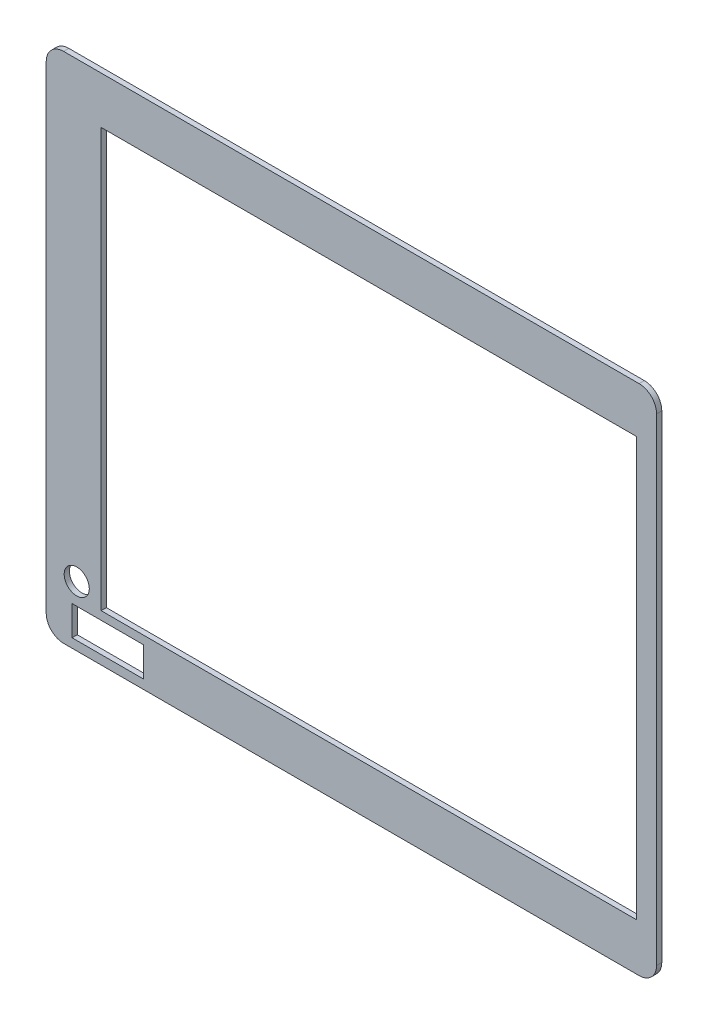
ISO-10303-21;
HEADER;
FILE_DESCRIPTION(('STEP AP214'),'2;1');
FILE_NAME('part.step','',(''),(''),'','','');
FILE_SCHEMA(('AUTOMOTIVE_DESIGN { 1 0 10303 214 1 1 1 1 }'));
ENDSEC;
DATA;
#1=APPLICATION_CONTEXT('core data for automotive mechanical design processes');
#2=APPLICATION_PROTOCOL_DEFINITION('international standard','automotive_design',2000,#1);
#3=PRODUCT_CONTEXT('',#1,'mechanical');
#4=PRODUCT('Part','Part','',(#3));
#5=PRODUCT_RELATED_PRODUCT_CATEGORY('part','',(#4));
#6=PRODUCT_DEFINITION_FORMATION('','',#4);
#7=PRODUCT_DEFINITION_CONTEXT('part definition',#1,'design');
#8=PRODUCT_DEFINITION('design','',#6,#7);
#9=PRODUCT_DEFINITION_SHAPE('','',#8);
#10=(LENGTH_UNIT() NAMED_UNIT(*) SI_UNIT(.MILLI.,.METRE.));
#11=(NAMED_UNIT(*) PLANE_ANGLE_UNIT() SI_UNIT($,.RADIAN.));
#12=(NAMED_UNIT(*) SI_UNIT($,.STERADIAN.) SOLID_ANGLE_UNIT());
#13=UNCERTAINTY_MEASURE_WITH_UNIT(LENGTH_MEASURE(1.E-05),#10,'distance_accuracy_value','');
#14=(GEOMETRIC_REPRESENTATION_CONTEXT(3) GLOBAL_UNCERTAINTY_ASSIGNED_CONTEXT((#13)) GLOBAL_UNIT_ASSIGNED_CONTEXT((#10,
#11,#12)) REPRESENTATION_CONTEXT('',''));
#15=CARTESIAN_POINT('',(0.,0.,0.));
#16=DIRECTION('',(0.,0.,1.));
#17=DIRECTION('',(1.,0.,0.));
#18=AXIS2_PLACEMENT_3D('',#15,#16,#17);
#19=CARTESIAN_POINT('',(0.,0.,6.));
#20=DIRECTION('',(0.,0.,-1.));
#21=DIRECTION('',(-1.,0.,0.));
#22=AXIS2_PLACEMENT_3D('',#19,#20,#21);
#23=PLANE('',#22);
#24=CARTESIAN_POINT('',(-315.,-225.,6.));
#25=DIRECTION('',(0.,0.,1.));
#26=DIRECTION('',(1.,0.,0.));
#27=AXIS2_PLACEMENT_3D('',#24,#25,#26);
#28=CIRCLE('',#27,14.4);
#29=CARTESIAN_POINT('',(-300.6,-225.,6.00000000000001));
#30=VERTEX_POINT('',#29);
#31=EDGE_CURVE('E193',#30,#30,#28,.T.);
#32=ORIENTED_EDGE('',*,*,#31,.F.);
#33=EDGE_LOOP('',(#32));
#34=FACE_BOUND('',#33,.T.);
#35=DIRECTION('',(-1.,0.,0.));
#36=VECTOR('',#35,1.);
#37=CARTESIAN_POINT('',(-350.,294.,6.));
#38=LINE('',#37,#36);
#39=CARTESIAN_POINT('',(330.,294.,6.));
#40=VERTEX_POINT('',#39);
#41=CARTESIAN_POINT('',(-330.,294.,6.));
#42=VERTEX_POINT('',#41);
#43=EDGE_CURVE('E228',#40,#42,#38,.T.);
#44=ORIENTED_EDGE('',*,*,#43,.T.);
#45=CARTESIAN_POINT('',(-330.,274.,6.));
#46=DIRECTION('',(0.,0.,-1.));
#47=DIRECTION('',(-1.,0.,0.));
#48=AXIS2_PLACEMENT_3D('',#45,#46,#47);
#49=CIRCLE('',#48,20.);
#50=CARTESIAN_POINT('',(-350.,274.,6.));
#51=VERTEX_POINT('',#50);
#52=EDGE_CURVE('E291',#42,#51,#49,.F.);
#53=ORIENTED_EDGE('',*,*,#52,.T.);
#54=DIRECTION('',(0.,-1.,0.));
#55=VECTOR('',#54,1.);
#56=CARTESIAN_POINT('',(-350.,-294.,6.));
#57=LINE('',#56,#55);
#58=CARTESIAN_POINT('',(-350.,-274.,6.));
#59=VERTEX_POINT('',#58);
#60=EDGE_CURVE('E233',#51,#59,#57,.T.);
#61=ORIENTED_EDGE('',*,*,#60,.T.);
#62=CARTESIAN_POINT('',(-330.,-274.,6.));
#63=DIRECTION('',(0.,0.,-1.));
#64=DIRECTION('',(-1.,0.,0.));
#65=AXIS2_PLACEMENT_3D('',#62,#63,#64);
#66=CIRCLE('',#65,20.);
#67=CARTESIAN_POINT('',(-330.,-294.,6.));
#68=VERTEX_POINT('',#67);
#69=EDGE_CURVE('E282',#59,#68,#66,.F.);
#70=ORIENTED_EDGE('',*,*,#69,.T.);
#71=DIRECTION('',(1.,0.,0.));
#72=VECTOR('',#71,1.);
#73=CARTESIAN_POINT('',(-350.,-294.,6.));
#74=LINE('',#73,#72);
#75=CARTESIAN_POINT('',(330.,-294.,6.));
#76=VERTEX_POINT('',#75);
#77=EDGE_CURVE('E237',#68,#76,#74,.T.);
#78=ORIENTED_EDGE('',*,*,#77,.T.);
#79=CARTESIAN_POINT('',(330.,-274.,6.));
#80=DIRECTION('',(0.,0.,-1.));
#81=DIRECTION('',(-1.,0.,0.));
#82=AXIS2_PLACEMENT_3D('',#79,#80,#81);
#83=CIRCLE('',#82,20.);
#84=CARTESIAN_POINT('',(350.,-274.,6.));
#85=VERTEX_POINT('',#84);
#86=EDGE_CURVE('E285',#76,#85,#83,.F.);
#87=ORIENTED_EDGE('',*,*,#86,.T.);
#88=DIRECTION('',(0.,1.,0.));
#89=VECTOR('',#88,1.);
#90=CARTESIAN_POINT('',(350.,-294.,6.));
#91=LINE('',#90,#89);
#92=CARTESIAN_POINT('',(350.,274.,6.));
#93=VERTEX_POINT('',#92);
#94=EDGE_CURVE('E224',#85,#93,#91,.T.);
#95=ORIENTED_EDGE('',*,*,#94,.T.);
#96=CARTESIAN_POINT('',(330.,274.,6.));
#97=DIRECTION('',(0.,0.,-1.));
#98=DIRECTION('',(-1.,0.,0.));
#99=AXIS2_PLACEMENT_3D('',#96,#97,#98);
#100=CIRCLE('',#99,20.);
#101=EDGE_CURVE('E288',#93,#40,#100,.F.);
#102=ORIENTED_EDGE('',*,*,#101,.T.);
#103=EDGE_LOOP('',(#44,#53,#61,#70,#78,#87,#95,#102));
#104=FACE_BOUND('',#103,.T.);
#105=DIRECTION('',(0.,1.,0.));
#106=VECTOR('',#105,1.);
#107=CARTESIAN_POINT('',(327.,-240.,6.));
#108=LINE('',#107,#106);
#109=CARTESIAN_POINT('',(327.,-240.,6.));
#110=VERTEX_POINT('',#109);
#111=CARTESIAN_POINT('',(327.,240.,6.));
#112=VERTEX_POINT('',#111);
#113=EDGE_CURVE('E200',#110,#112,#108,.T.);
#114=ORIENTED_EDGE('',*,*,#113,.F.);
#115=DIRECTION('',(1.,0.,0.));
#116=VECTOR('',#115,1.);
#117=CARTESIAN_POINT('',(-287.,-240.,6.));
#118=LINE('',#117,#116);
#119=CARTESIAN_POINT('',(-287.,-240.,6.));
#120=VERTEX_POINT('',#119);
#121=EDGE_CURVE('E70',#120,#110,#118,.T.);
#122=ORIENTED_EDGE('',*,*,#121,.F.);
#123=DIRECTION('',(0.,1.,0.));
#124=VECTOR('',#123,1.);
#125=CARTESIAN_POINT('',(-287.,-240.,6.));
#126=LINE('',#125,#124);
#127=CARTESIAN_POINT('',(-287.,240.,6.));
#128=VERTEX_POINT('',#127);
#129=EDGE_CURVE('E208',#120,#128,#126,.T.);
#130=ORIENTED_EDGE('',*,*,#129,.T.);
#131=DIRECTION('',(1.,0.,0.));
#132=VECTOR('',#131,1.);
#133=CARTESIAN_POINT('',(-287.,240.,6.));
#134=LINE('',#133,#132);
#135=EDGE_CURVE('E204',#128,#112,#134,.T.);
#136=ORIENTED_EDGE('',*,*,#135,.T.);
#137=EDGE_LOOP('',(#114,#122,#130,#136));
#138=FACE_BOUND('',#137,.T.);
#139=DIRECTION('',(0.,1.,0.));
#140=VECTOR('',#139,1.);
#141=CARTESIAN_POINT('',(-320.35,-283.6,6.));
#142=LINE('',#141,#140);
#143=CARTESIAN_POINT('',(-320.35,-283.6,6.));
#144=VERTEX_POINT('',#143);
#145=CARTESIAN_POINT('',(-320.35,-249.6,6.));
#146=VERTEX_POINT('',#145);
#147=EDGE_CURVE('E62',#144,#146,#142,.T.);
#148=ORIENTED_EDGE('',*,*,#147,.T.);
#149=DIRECTION('',(1.,0.,0.));
#150=VECTOR('',#149,1.);
#151=CARTESIAN_POINT('',(-320.35,-249.6,6.));
#152=LINE('',#151,#150);
#153=CARTESIAN_POINT('',(-238.35,-249.6,6.));
#154=VERTEX_POINT('',#153);
#155=EDGE_CURVE('E184',#146,#154,#152,.T.);
#156=ORIENTED_EDGE('',*,*,#155,.T.);
#157=DIRECTION('',(0.,1.,0.));
#158=VECTOR('',#157,1.);
#159=CARTESIAN_POINT('',(-238.35,-283.6,6.));
#160=LINE('',#159,#158);
#161=CARTESIAN_POINT('',(-238.35,-283.6,6.));
#162=VERTEX_POINT('',#161);
#163=EDGE_CURVE('E167',#162,#154,#160,.T.);
#164=ORIENTED_EDGE('',*,*,#163,.F.);
#165=DIRECTION('',(1.,0.,0.));
#166=VECTOR('',#165,1.);
#167=CARTESIAN_POINT('',(-320.35,-283.6,6.));
#168=LINE('',#167,#166);
#169=EDGE_CURVE('E178',#144,#162,#168,.T.);
#170=ORIENTED_EDGE('',*,*,#169,.F.);
#171=EDGE_LOOP('',(#148,#156,#164,#170));
#172=FACE_BOUND('',#171,.T.);
#173=ADVANCED_FACE('F45',(#34,#104,#138,#172),#23,.F.);
#174=CARTESIAN_POINT('',(0.,0.,0.));
#175=DIRECTION('',(0.,0.,-1.));
#176=DIRECTION('',(-1.,0.,0.));
#177=AXIS2_PLACEMENT_3D('',#174,#175,#176);
#178=PLANE('',#177);
#179=CARTESIAN_POINT('',(-315.,-225.,0.));
#180=DIRECTION('',(0.,0.,-1.));
#181=DIRECTION('',(-1.,0.,0.));
#182=AXIS2_PLACEMENT_3D('',#179,#180,#181);
#183=CIRCLE('',#182,14.4);
#184=CARTESIAN_POINT('',(-300.6,-225.,0.));
#185=VERTEX_POINT('',#184);
#186=EDGE_CURVE('E49',#185,#185,#183,.T.);
#187=ORIENTED_EDGE('',*,*,#186,.F.);
#188=EDGE_LOOP('',(#187));
#189=FACE_BOUND('',#188,.T.);
#190=DIRECTION('',(-1.,0.,0.));
#191=VECTOR('',#190,1.);
#192=CARTESIAN_POINT('',(0.,-240.,0.));
#193=LINE('',#192,#191);
#194=CARTESIAN_POINT('',(327.,-240.,0.));
#195=VERTEX_POINT('',#194);
#196=CARTESIAN_POINT('',(-287.,-240.,0.));
#197=VERTEX_POINT('',#196);
#198=EDGE_CURVE('E319',#195,#197,#193,.T.);
#199=ORIENTED_EDGE('',*,*,#198,.F.);
#200=DIRECTION('',(0.,-1.,0.));
#201=VECTOR('',#200,1.);
#202=CARTESIAN_POINT('',(327.,0.,0.));
#203=LINE('',#202,#201);
#204=CARTESIAN_POINT('',(327.,240.,0.));
#205=VERTEX_POINT('',#204);
#206=EDGE_CURVE('E308',#205,#195,#203,.T.);
#207=ORIENTED_EDGE('',*,*,#206,.F.);
#208=DIRECTION('',(-1.,0.,0.));
#209=VECTOR('',#208,1.);
#210=CARTESIAN_POINT('',(0.,240.,0.));
#211=LINE('',#210,#209);
#212=CARTESIAN_POINT('',(-287.,240.,0.));
#213=VERTEX_POINT('',#212);
#214=EDGE_CURVE('E311',#205,#213,#211,.T.);
#215=ORIENTED_EDGE('',*,*,#214,.T.);
#216=DIRECTION('',(0.,-1.,0.));
#217=VECTOR('',#216,1.);
#218=CARTESIAN_POINT('',(-287.,0.,0.));
#219=LINE('',#218,#217);
#220=EDGE_CURVE('E315',#213,#197,#219,.T.);
#221=ORIENTED_EDGE('',*,*,#220,.T.);
#222=EDGE_LOOP('',(#199,#207,#215,#221));
#223=FACE_BOUND('',#222,.T.);
#224=DIRECTION('',(0.,-1.,0.));
#225=VECTOR('',#224,1.);
#226=CARTESIAN_POINT('',(-350.,-294.,0.));
#227=LINE('',#226,#225);
#228=CARTESIAN_POINT('',(-350.,274.,0.));
#229=VERTEX_POINT('',#228);
#230=CARTESIAN_POINT('',(-350.,-274.,0.));
#231=VERTEX_POINT('',#230);
#232=EDGE_CURVE('E250',#229,#231,#227,.T.);
#233=ORIENTED_EDGE('',*,*,#232,.F.);
#234=CARTESIAN_POINT('',(-330.,274.,0.));
#235=DIRECTION('',(0.,0.,-1.));
#236=DIRECTION('',(-1.,0.,0.));
#237=AXIS2_PLACEMENT_3D('',#234,#235,#236);
#238=CIRCLE('',#237,20.);
#239=CARTESIAN_POINT('',(-330.,294.,0.));
#240=VERTEX_POINT('',#239);
#241=EDGE_CURVE('E272',#229,#240,#238,.T.);
#242=ORIENTED_EDGE('',*,*,#241,.T.);
#243=DIRECTION('',(-1.,0.,0.));
#244=VECTOR('',#243,1.);
#245=CARTESIAN_POINT('',(-350.,294.,0.));
#246=LINE('',#245,#244);
#247=CARTESIAN_POINT('',(330.,294.,0.));
#248=VERTEX_POINT('',#247);
#249=EDGE_CURVE('E246',#248,#240,#246,.T.);
#250=ORIENTED_EDGE('',*,*,#249,.F.);
#251=CARTESIAN_POINT('',(330.,274.,0.));
#252=DIRECTION('',(0.,0.,-1.));
#253=DIRECTION('',(-1.,0.,0.));
#254=AXIS2_PLACEMENT_3D('',#251,#252,#253);
#255=CIRCLE('',#254,20.);
#256=CARTESIAN_POINT('',(350.,274.,0.));
#257=VERTEX_POINT('',#256);
#258=EDGE_CURVE('E269',#248,#257,#255,.T.);
#259=ORIENTED_EDGE('',*,*,#258,.T.);
#260=DIRECTION('',(0.,1.,0.));
#261=VECTOR('',#260,1.);
#262=CARTESIAN_POINT('',(350.,-294.,0.));
#263=LINE('',#262,#261);
#264=CARTESIAN_POINT('',(350.,-274.,0.));
#265=VERTEX_POINT('',#264);
#266=EDGE_CURVE('E242',#265,#257,#263,.T.);
#267=ORIENTED_EDGE('',*,*,#266,.F.);
#268=CARTESIAN_POINT('',(330.,-274.,0.));
#269=DIRECTION('',(0.,0.,-1.));
#270=DIRECTION('',(-1.,0.,0.));
#271=AXIS2_PLACEMENT_3D('',#268,#269,#270);
#272=CIRCLE('',#271,20.);
#273=CARTESIAN_POINT('',(330.,-294.,0.));
#274=VERTEX_POINT('',#273);
#275=EDGE_CURVE('E266',#265,#274,#272,.T.);
#276=ORIENTED_EDGE('',*,*,#275,.T.);
#277=DIRECTION('',(1.,0.,0.));
#278=VECTOR('',#277,1.);
#279=CARTESIAN_POINT('',(-350.,-294.,0.));
#280=LINE('',#279,#278);
#281=CARTESIAN_POINT('',(-330.,-294.,0.));
#282=VERTEX_POINT('',#281);
#283=EDGE_CURVE('E229',#282,#274,#280,.T.);
#284=ORIENTED_EDGE('',*,*,#283,.F.);
#285=CARTESIAN_POINT('',(-330.,-274.,0.));
#286=DIRECTION('',(0.,0.,-1.));
#287=DIRECTION('',(-1.,0.,0.));
#288=AXIS2_PLACEMENT_3D('',#285,#286,#287);
#289=CIRCLE('',#288,20.);
#290=EDGE_CURVE('E263',#282,#231,#289,.T.);
#291=ORIENTED_EDGE('',*,*,#290,.T.);
#292=EDGE_LOOP('',(#233,#242,#250,#259,#267,#276,#284,#291));
#293=FACE_BOUND('',#292,.T.);
#294=DIRECTION('',(-1.,0.,0.));
#295=VECTOR('',#294,1.);
#296=CARTESIAN_POINT('',(0.,-249.6,0.));
#297=LINE('',#296,#295);
#298=CARTESIAN_POINT('',(-238.35,-249.6,0.));
#299=VERTEX_POINT('',#298);
#300=CARTESIAN_POINT('',(-320.35,-249.6,0.));
#301=VERTEX_POINT('',#300);
#302=EDGE_CURVE('E55',#299,#301,#297,.T.);
#303=ORIENTED_EDGE('',*,*,#302,.T.);
#304=DIRECTION('',(0.,-1.,0.));
#305=VECTOR('',#304,1.);
#306=CARTESIAN_POINT('',(-320.35,0.,0.));
#307=LINE('',#306,#305);
#308=CARTESIAN_POINT('',(-320.35,-283.6,0.));
#309=VERTEX_POINT('',#308);
#310=EDGE_CURVE('E11',#301,#309,#307,.T.);
#311=ORIENTED_EDGE('',*,*,#310,.T.);
#312=DIRECTION('',(-1.,0.,0.));
#313=VECTOR('',#312,1.);
#314=CARTESIAN_POINT('',(0.,-283.6,0.));
#315=LINE('',#314,#313);
#316=CARTESIAN_POINT('',(-238.35,-283.6,0.));
#317=VERTEX_POINT('',#316);
#318=EDGE_CURVE('E322',#317,#309,#315,.T.);
#319=ORIENTED_EDGE('',*,*,#318,.F.);
#320=DIRECTION('',(0.,-1.,0.));
#321=VECTOR('',#320,1.);
#322=CARTESIAN_POINT('',(-238.35,0.,0.));
#323=LINE('',#322,#321);
#324=EDGE_CURVE('E170',#299,#317,#323,.T.);
#325=ORIENTED_EDGE('',*,*,#324,.F.);
#326=EDGE_LOOP('',(#303,#311,#319,#325));
#327=FACE_BOUND('',#326,.T.);
#328=ADVANCED_FACE('F330',(#189,#223,#293,#327),#178,.T.);
#329=CARTESIAN_POINT('',(350.,-294.,6.));
#330=DIRECTION('',(-1.,0.,0.));
#331=DIRECTION('',(0.,0.,1.));
#332=AXIS2_PLACEMENT_3D('',#329,#330,#331);
#333=PLANE('',#332);
#334=ORIENTED_EDGE('',*,*,#266,.T.);
#335=DIRECTION('',(0.,0.,-1.));
#336=VECTOR('',#335,1.);
#337=CARTESIAN_POINT('',(350.,274.,6.));
#338=LINE('',#337,#336);
#339=EDGE_CURVE('E298',#257,#93,#338,.F.);
#340=ORIENTED_EDGE('',*,*,#339,.T.);
#341=ORIENTED_EDGE('',*,*,#94,.F.);
#342=DIRECTION('',(0.,0.,-1.));
#343=VECTOR('',#342,1.);
#344=CARTESIAN_POINT('',(350.,-274.,6.));
#345=LINE('',#344,#343);
#346=EDGE_CURVE('E294',#85,#265,#345,.T.);
#347=ORIENTED_EDGE('',*,*,#346,.T.);
#348=EDGE_LOOP('',(#334,#340,#341,#347));
#349=FACE_BOUND('',#348,.T.);
#350=ADVANCED_FACE('F358',(#349),#333,.F.);
#351=CARTESIAN_POINT('',(-350.,294.,6.));
#352=DIRECTION('',(0.,-1.,0.));
#353=DIRECTION('',(0.,0.,-1.));
#354=AXIS2_PLACEMENT_3D('',#351,#352,#353);
#355=PLANE('',#354);
#356=ORIENTED_EDGE('',*,*,#249,.T.);
#357=DIRECTION('',(0.,0.,-1.));
#358=VECTOR('',#357,1.);
#359=CARTESIAN_POINT('',(-330.,294.,6.));
#360=LINE('',#359,#358);
#361=EDGE_CURVE('E279',#240,#42,#360,.F.);
#362=ORIENTED_EDGE('',*,*,#361,.T.);
#363=ORIENTED_EDGE('',*,*,#43,.F.);
#364=DIRECTION('',(0.,0.,-1.));
#365=VECTOR('',#364,1.);
#366=CARTESIAN_POINT('',(330.,294.,6.));
#367=LINE('',#366,#365);
#368=EDGE_CURVE('E275',#40,#248,#367,.T.);
#369=ORIENTED_EDGE('',*,*,#368,.T.);
#370=EDGE_LOOP('',(#356,#362,#363,#369));
#371=FACE_BOUND('',#370,.T.);
#372=ADVANCED_FACE('F374',(#371),#355,.F.);
#373=CARTESIAN_POINT('',(-350.,-294.,6.));
#374=DIRECTION('',(1.,0.,0.));
#375=DIRECTION('',(0.,0.,-1.));
#376=AXIS2_PLACEMENT_3D('',#373,#374,#375);
#377=PLANE('',#376);
#378=ORIENTED_EDGE('',*,*,#60,.F.);
#379=DIRECTION('',(0.,0.,-1.));
#380=VECTOR('',#379,1.);
#381=CARTESIAN_POINT('',(-350.,274.,6.));
#382=LINE('',#381,#380);
#383=EDGE_CURVE('E259',#51,#229,#382,.T.);
#384=ORIENTED_EDGE('',*,*,#383,.T.);
#385=ORIENTED_EDGE('',*,*,#232,.T.);
#386=DIRECTION('',(0.,0.,-1.));
#387=VECTOR('',#386,1.);
#388=CARTESIAN_POINT('',(-350.,-274.,6.));
#389=LINE('',#388,#387);
#390=EDGE_CURVE('E241',#231,#59,#389,.F.);
#391=ORIENTED_EDGE('',*,*,#390,.T.);
#392=EDGE_LOOP('',(#378,#384,#385,#391));
#393=FACE_BOUND('',#392,.T.);
#394=ADVANCED_FACE('F370',(#393),#377,.F.);
#395=CARTESIAN_POINT('',(-350.,-294.,6.));
#396=DIRECTION('',(0.,1.,0.));
#397=DIRECTION('',(0.,0.,1.));
#398=AXIS2_PLACEMENT_3D('',#395,#396,#397);
#399=PLANE('',#398);
#400=ORIENTED_EDGE('',*,*,#283,.T.);
#401=DIRECTION('',(0.,0.,-1.));
#402=VECTOR('',#401,1.);
#403=CARTESIAN_POINT('',(330.,-294.,6.));
#404=LINE('',#403,#402);
#405=EDGE_CURVE('E305',#274,#76,#404,.F.);
#406=ORIENTED_EDGE('',*,*,#405,.T.);
#407=ORIENTED_EDGE('',*,*,#77,.F.);
#408=DIRECTION('',(0.,0.,-1.));
#409=VECTOR('',#408,1.);
#410=CARTESIAN_POINT('',(-330.,-294.,6.));
#411=LINE('',#410,#409);
#412=EDGE_CURVE('E301',#68,#282,#411,.T.);
#413=ORIENTED_EDGE('',*,*,#412,.T.);
#414=EDGE_LOOP('',(#400,#406,#407,#413));
#415=FACE_BOUND('',#414,.T.);
#416=ADVANCED_FACE('F366',(#415),#399,.F.);
#417=CARTESIAN_POINT('',(-330.,274.,6.));
#418=DIRECTION('',(0.,0.,-1.));
#419=DIRECTION('',(-1.,0.,0.));
#420=AXIS2_PLACEMENT_3D('',#417,#418,#419);
#421=CYLINDRICAL_SURFACE('',#420,20.);
#422=ORIENTED_EDGE('',*,*,#52,.F.);
#423=ORIENTED_EDGE('',*,*,#361,.F.);
#424=ORIENTED_EDGE('',*,*,#241,.F.);
#425=ORIENTED_EDGE('',*,*,#383,.F.);
#426=EDGE_LOOP('',(#422,#423,#424,#425));
#427=FACE_BOUND('',#426,.T.);
#428=ADVANCED_FACE('F369',(#427),#421,.T.);
#429=CARTESIAN_POINT('',(330.,274.,6.));
#430=DIRECTION('',(0.,0.,-1.));
#431=DIRECTION('',(-1.,0.,0.));
#432=AXIS2_PLACEMENT_3D('',#429,#430,#431);
#433=CYLINDRICAL_SURFACE('',#432,20.);
#434=ORIENTED_EDGE('',*,*,#101,.F.);
#435=ORIENTED_EDGE('',*,*,#339,.F.);
#436=ORIENTED_EDGE('',*,*,#258,.F.);
#437=ORIENTED_EDGE('',*,*,#368,.F.);
#438=EDGE_LOOP('',(#434,#435,#436,#437));
#439=FACE_BOUND('',#438,.T.);
#440=ADVANCED_FACE('F384',(#439),#433,.T.);
#441=CARTESIAN_POINT('',(330.,-274.,6.));
#442=DIRECTION('',(0.,0.,-1.));
#443=DIRECTION('',(-1.,0.,0.));
#444=AXIS2_PLACEMENT_3D('',#441,#442,#443);
#445=CYLINDRICAL_SURFACE('',#444,20.);
#446=ORIENTED_EDGE('',*,*,#86,.F.);
#447=ORIENTED_EDGE('',*,*,#405,.F.);
#448=ORIENTED_EDGE('',*,*,#275,.F.);
#449=ORIENTED_EDGE('',*,*,#346,.F.);
#450=EDGE_LOOP('',(#446,#447,#448,#449));
#451=FACE_BOUND('',#450,.T.);
#452=ADVANCED_FACE('F387',(#451),#445,.T.);
#453=CARTESIAN_POINT('',(-330.,-274.,6.));
#454=DIRECTION('',(0.,0.,-1.));
#455=DIRECTION('',(-1.,0.,0.));
#456=AXIS2_PLACEMENT_3D('',#453,#454,#455);
#457=CYLINDRICAL_SURFACE('',#456,20.);
#458=ORIENTED_EDGE('',*,*,#69,.F.);
#459=ORIENTED_EDGE('',*,*,#390,.F.);
#460=ORIENTED_EDGE('',*,*,#290,.F.);
#461=ORIENTED_EDGE('',*,*,#412,.F.);
#462=EDGE_LOOP('',(#458,#459,#460,#461));
#463=FACE_BOUND('',#462,.T.);
#464=ADVANCED_FACE('F47',(#463),#457,.T.);
#465=CARTESIAN_POINT('',(-287.,-240.,-78.));
#466=DIRECTION('',(0.,-1.,0.));
#467=DIRECTION('',(0.,0.,-1.));
#468=AXIS2_PLACEMENT_3D('',#465,#466,#467);
#469=PLANE('',#468);
#470=ORIENTED_EDGE('',*,*,#198,.T.);
#471=DIRECTION('',(0.,0.,1.));
#472=VECTOR('',#471,1.);
#473=CARTESIAN_POINT('',(-287.,-240.,-78.));
#474=LINE('',#473,#472);
#475=EDGE_CURVE('E213',#197,#120,#474,.T.);
#476=ORIENTED_EDGE('',*,*,#475,.T.);
#477=ORIENTED_EDGE('',*,*,#121,.T.);
#478=DIRECTION('',(0.,0.,1.));
#479=VECTOR('',#478,1.);
#480=CARTESIAN_POINT('',(327.,-240.,-78.));
#481=LINE('',#480,#479);
#482=EDGE_CURVE('E212',#195,#110,#481,.T.);
#483=ORIENTED_EDGE('',*,*,#482,.F.);
#484=EDGE_LOOP('',(#470,#476,#477,#483));
#485=FACE_BOUND('',#484,.T.);
#486=ADVANCED_FACE('F364',(#485),#469,.F.);
#487=CARTESIAN_POINT('',(-287.,-240.,-78.));
#488=DIRECTION('',(1.,0.,0.));
#489=DIRECTION('',(0.,0.,-1.));
#490=AXIS2_PLACEMENT_3D('',#487,#488,#489);
#491=PLANE('',#490);
#492=DIRECTION('',(0.,0.,1.));
#493=VECTOR('',#492,1.);
#494=CARTESIAN_POINT('',(-287.,240.,-78.));
#495=LINE('',#494,#493);
#496=EDGE_CURVE('E216',#213,#128,#495,.T.);
#497=ORIENTED_EDGE('',*,*,#496,.T.);
#498=ORIENTED_EDGE('',*,*,#129,.F.);
#499=ORIENTED_EDGE('',*,*,#475,.F.);
#500=ORIENTED_EDGE('',*,*,#220,.F.);
#501=EDGE_LOOP('',(#497,#498,#499,#500));
#502=FACE_BOUND('',#501,.T.);
#503=ADVANCED_FACE('F425',(#502),#491,.T.);
#504=CARTESIAN_POINT('',(-287.,240.,-78.));
#505=DIRECTION('',(0.,-1.,0.));
#506=DIRECTION('',(0.,0.,-1.));
#507=AXIS2_PLACEMENT_3D('',#504,#505,#506);
#508=PLANE('',#507);
#509=DIRECTION('',(0.,0.,1.));
#510=VECTOR('',#509,1.);
#511=CARTESIAN_POINT('',(327.,240.,-78.));
#512=LINE('',#511,#510);
#513=EDGE_CURVE('E219',#205,#112,#512,.T.);
#514=ORIENTED_EDGE('',*,*,#513,.T.);
#515=ORIENTED_EDGE('',*,*,#135,.F.);
#516=ORIENTED_EDGE('',*,*,#496,.F.);
#517=ORIENTED_EDGE('',*,*,#214,.F.);
#518=EDGE_LOOP('',(#514,#515,#516,#517));
#519=FACE_BOUND('',#518,.T.);
#520=ADVANCED_FACE('F348',(#519),#508,.T.);
#521=CARTESIAN_POINT('',(327.,-240.,-78.));
#522=DIRECTION('',(1.,0.,0.));
#523=DIRECTION('',(0.,0.,-1.));
#524=AXIS2_PLACEMENT_3D('',#521,#522,#523);
#525=PLANE('',#524);
#526=ORIENTED_EDGE('',*,*,#206,.T.);
#527=ORIENTED_EDGE('',*,*,#482,.T.);
#528=ORIENTED_EDGE('',*,*,#113,.T.);
#529=ORIENTED_EDGE('',*,*,#513,.F.);
#530=EDGE_LOOP('',(#526,#527,#528,#529));
#531=FACE_BOUND('',#530,.T.);
#532=ADVANCED_FACE('F341',(#531),#525,.F.);
#533=CARTESIAN_POINT('',(-320.35,-283.6,-78.));
#534=DIRECTION('',(1.,0.,0.));
#535=DIRECTION('',(0.,0.,-1.));
#536=AXIS2_PLACEMENT_3D('',#533,#534,#535);
#537=PLANE('',#536);
#538=DIRECTION('',(0.,0.,1.));
#539=VECTOR('',#538,1.);
#540=CARTESIAN_POINT('',(-320.35,-249.6,-78.));
#541=LINE('',#540,#539);
#542=EDGE_CURVE('E197',#301,#146,#541,.T.);
#543=ORIENTED_EDGE('',*,*,#542,.T.);
#544=ORIENTED_EDGE('',*,*,#147,.F.);
#545=DIRECTION('',(0.,0.,1.));
#546=VECTOR('',#545,1.);
#547=CARTESIAN_POINT('',(-320.35,-283.6,-78.));
#548=LINE('',#547,#546);
#549=EDGE_CURVE('E174',#309,#144,#548,.T.);
#550=ORIENTED_EDGE('',*,*,#549,.F.);
#551=ORIENTED_EDGE('',*,*,#310,.F.);
#552=EDGE_LOOP('',(#543,#544,#550,#551));
#553=FACE_BOUND('',#552,.T.);
#554=ADVANCED_FACE('F339',(#553),#537,.T.);
#555=CARTESIAN_POINT('',(-320.35,-249.6,-78.));
#556=DIRECTION('',(0.,-1.,0.));
#557=DIRECTION('',(0.,0.,-1.));
#558=AXIS2_PLACEMENT_3D('',#555,#556,#557);
#559=PLANE('',#558);
#560=DIRECTION('',(0.,0.,1.));
#561=VECTOR('',#560,1.);
#562=CARTESIAN_POINT('',(-238.35,-249.6,-78.));
#563=LINE('',#562,#561);
#564=EDGE_CURVE('E175',#299,#154,#563,.T.);
#565=ORIENTED_EDGE('',*,*,#564,.T.);
#566=ORIENTED_EDGE('',*,*,#155,.F.);
#567=ORIENTED_EDGE('',*,*,#542,.F.);
#568=ORIENTED_EDGE('',*,*,#302,.F.);
#569=EDGE_LOOP('',(#565,#566,#567,#568));
#570=FACE_BOUND('',#569,.T.);
#571=ADVANCED_FACE('F333',(#570),#559,.T.);
#572=CARTESIAN_POINT('',(-238.35,-283.6,-78.));
#573=DIRECTION('',(1.,0.,0.));
#574=DIRECTION('',(0.,0.,-1.));
#575=AXIS2_PLACEMENT_3D('',#572,#573,#574);
#576=PLANE('',#575);
#577=ORIENTED_EDGE('',*,*,#324,.T.);
#578=DIRECTION('',(0.,0.,1.));
#579=VECTOR('',#578,1.);
#580=CARTESIAN_POINT('',(-238.35,-283.6,-78.));
#581=LINE('',#580,#579);
#582=EDGE_CURVE('E162',#317,#162,#581,.T.);
#583=ORIENTED_EDGE('',*,*,#582,.T.);
#584=ORIENTED_EDGE('',*,*,#163,.T.);
#585=ORIENTED_EDGE('',*,*,#564,.F.);
#586=EDGE_LOOP('',(#577,#583,#584,#585));
#587=FACE_BOUND('',#586,.T.);
#588=ADVANCED_FACE('F164',(#587),#576,.F.);
#589=CARTESIAN_POINT('',(-320.35,-283.6,-78.));
#590=DIRECTION('',(0.,-1.,0.));
#591=DIRECTION('',(0.,0.,-1.));
#592=AXIS2_PLACEMENT_3D('',#589,#590,#591);
#593=PLANE('',#592);
#594=ORIENTED_EDGE('',*,*,#318,.T.);
#595=ORIENTED_EDGE('',*,*,#549,.T.);
#596=ORIENTED_EDGE('',*,*,#169,.T.);
#597=ORIENTED_EDGE('',*,*,#582,.F.);
#598=EDGE_LOOP('',(#594,#595,#596,#597));
#599=FACE_BOUND('',#598,.T.);
#600=ADVANCED_FACE('F179',(#599),#593,.F.);
#601=CARTESIAN_POINT('',(-315.,-225.,-78.));
#602=DIRECTION('',(0.,0.,1.));
#603=DIRECTION('',(1.,0.,0.));
#604=AXIS2_PLACEMENT_3D('',#601,#602,#603);
#605=CYLINDRICAL_SURFACE('',#604,14.4);
#606=CARTESIAN_POINT('',(-300.6,-225.,0.));
#607=CARTESIAN_POINT('',(-300.6,-225.,0.0625000000000024));
#608=CARTESIAN_POINT('',(-300.6,-225.,0.125000000000005));
#609=CARTESIAN_POINT('',(-300.6,-225.,0.250000000000005));
#610=CARTESIAN_POINT('',(-300.6,-225.,0.312500000000003));
#611=CARTESIAN_POINT('',(-300.6,-225.,0.437499999999998));
#612=CARTESIAN_POINT('',(-300.6,-225.,0.499999999999996));
#613=CARTESIAN_POINT('',(-300.6,-225.,0.624999999999996));
#614=CARTESIAN_POINT('',(-300.6,-225.,0.687499999999998));
#615=CARTESIAN_POINT('',(-300.6,-225.,0.812500000000003));
#616=CARTESIAN_POINT('',(-300.6,-225.,0.875000000000005));
#617=CARTESIAN_POINT('',(-300.6,-225.,1.00000000000001));
#618=CARTESIAN_POINT('',(-300.6,-225.,1.0625));
#619=CARTESIAN_POINT('',(-300.6,-225.,1.1875));
#620=CARTESIAN_POINT('',(-300.6,-225.,1.25));
#621=CARTESIAN_POINT('',(-300.6,-225.,1.375));
#622=CARTESIAN_POINT('',(-300.6,-225.,1.4375));
#623=CARTESIAN_POINT('',(-300.6,-225.,1.5625));
#624=CARTESIAN_POINT('',(-300.6,-225.,1.62500000000001));
#625=CARTESIAN_POINT('',(-300.6,-225.,1.75000000000001));
#626=CARTESIAN_POINT('',(-300.6,-225.,1.8125));
#627=CARTESIAN_POINT('',(-300.6,-225.,1.9375));
#628=CARTESIAN_POINT('',(-300.6,-225.,2.));
#629=CARTESIAN_POINT('',(-300.6,-225.,2.125));
#630=CARTESIAN_POINT('',(-300.6,-225.,2.1875));
#631=CARTESIAN_POINT('',(-300.6,-225.,2.3125));
#632=CARTESIAN_POINT('',(-300.6,-225.,2.37500000000001));
#633=CARTESIAN_POINT('',(-300.6,-225.,2.50000000000001));
#634=CARTESIAN_POINT('',(-300.6,-225.,2.5625));
#635=CARTESIAN_POINT('',(-300.6,-225.,2.6875));
#636=CARTESIAN_POINT('',(-300.6,-225.,2.75));
#637=CARTESIAN_POINT('',(-300.6,-225.,2.875));
#638=CARTESIAN_POINT('',(-300.6,-225.,2.9375));
#639=CARTESIAN_POINT('',(-300.6,-225.,3.0625));
#640=CARTESIAN_POINT('',(-300.6,-225.,3.12500000000001));
#641=CARTESIAN_POINT('',(-300.6,-225.,3.25000000000001));
#642=CARTESIAN_POINT('',(-300.6,-225.,3.31250000000001));
#643=CARTESIAN_POINT('',(-300.6,-225.,3.4375));
#644=CARTESIAN_POINT('',(-300.6,-225.,3.5));
#645=CARTESIAN_POINT('',(-300.6,-225.,3.625));
#646=CARTESIAN_POINT('',(-300.6,-225.,3.6875));
#647=CARTESIAN_POINT('',(-300.6,-225.,3.81250000000001));
#648=CARTESIAN_POINT('',(-300.6,-225.,3.87500000000001));
#649=CARTESIAN_POINT('',(-300.6,-225.,4.00000000000001));
#650=CARTESIAN_POINT('',(-300.6,-225.,4.06250000000001));
#651=CARTESIAN_POINT('',(-300.6,-225.,4.1875));
#652=CARTESIAN_POINT('',(-300.6,-225.,4.25));
#653=CARTESIAN_POINT('',(-300.6,-225.,4.375));
#654=CARTESIAN_POINT('',(-300.6,-225.,4.4375));
#655=CARTESIAN_POINT('',(-300.6,-225.,4.56250000000001));
#656=CARTESIAN_POINT('',(-300.6,-225.,4.62500000000001));
#657=CARTESIAN_POINT('',(-300.6,-225.,4.75000000000001));
#658=CARTESIAN_POINT('',(-300.6,-225.,4.81250000000001));
#659=CARTESIAN_POINT('',(-300.6,-225.,4.9375));
#660=CARTESIAN_POINT('',(-300.6,-225.,5.));
#661=CARTESIAN_POINT('',(-300.6,-225.,5.125));
#662=CARTESIAN_POINT('',(-300.6,-225.,5.1875));
#663=CARTESIAN_POINT('',(-300.6,-225.,5.31250000000001));
#664=CARTESIAN_POINT('',(-300.6,-225.,5.37500000000001));
#665=CARTESIAN_POINT('',(-300.6,-225.,5.50000000000001));
#666=CARTESIAN_POINT('',(-300.6,-225.,5.56250000000001));
#667=CARTESIAN_POINT('',(-300.6,-225.,5.6875));
#668=CARTESIAN_POINT('',(-300.6,-225.,5.75));
#669=CARTESIAN_POINT('',(-300.6,-225.,5.875));
#670=CARTESIAN_POINT('',(-300.6,-225.,5.9375));
#671=CARTESIAN_POINT('',(-300.6,-225.,6.00000000000001));
#672=B_SPLINE_CURVE_WITH_KNOTS('',3,(#606,#607,#608,#609,#610,#611,#612,#613,#614,#615,#616,
#617,#618,#619,#620,#621,#622,#623,#624,#625,#626,#627,#628,#629,#630,#631,#632,#633,#634,#635,
#636,#637,#638,#639,#640,#641,#642,#643,#644,#645,#646,#647,#648,#649,#650,#651,#652,#653,#654,
#655,#656,#657,#658,#659,#660,#661,#662,#663,#664,#665,#666,#667,#668,#669,#670,#671),
.UNSPECIFIED.,.F.,.F.,(4,2,2,2,2,2,2,2,2,2,2,2,2,2,2,2,2,2,2,2,2,2,2,2,2,2,2,2,2,2,2,2,4),(0.,
0.187500000000007,0.375,0.562499999999994,0.750000000000001,0.937500000000008,1.125,
1.31249999999999,1.5,1.68750000000001,1.875,2.06249999999999,2.25,2.43750000000001,2.625,2.8125,
3.,3.18750000000001,3.375,3.5625,3.75,3.93750000000001,4.125,4.3125,4.5,4.68750000000001,4.875,
5.0625,5.25,5.43750000000001,5.62500000000001,5.8125,6.00000000000001),.UNSPECIFIED.);
#673=EDGE_CURVE('BSEAM435',#185,#30,#672,.T.);
#674=ORIENTED_EDGE('',*,*,#186,.T.);
#675=ORIENTED_EDGE('',*,*,#31,.T.);
#676=ORIENTED_EDGE('',*,*,#673,.T.);
#677=ORIENTED_EDGE('',*,*,#673,.F.);
#678=EDGE_LOOP('',(#674,#676,#675,#677));
#679=FACE_BOUND('',#678,.T.);
#680=ADVANCED_FACE('F435',(#679),#605,.F.);
#681=CLOSED_SHELL('',(#173,#328,#350,#372,#394,#416,#428,#440,#452,#464,#486,#503,#520,#532,
#554,#571,#588,#600,#680));
#682=MANIFOLD_SOLID_BREP('B2',#681);
#683=ADVANCED_BREP_SHAPE_REPRESENTATION('',(#18,#682),#14);
#684=SHAPE_DEFINITION_REPRESENTATION(#9,#683);
ENDSEC;
END-ISO-10303-21;
